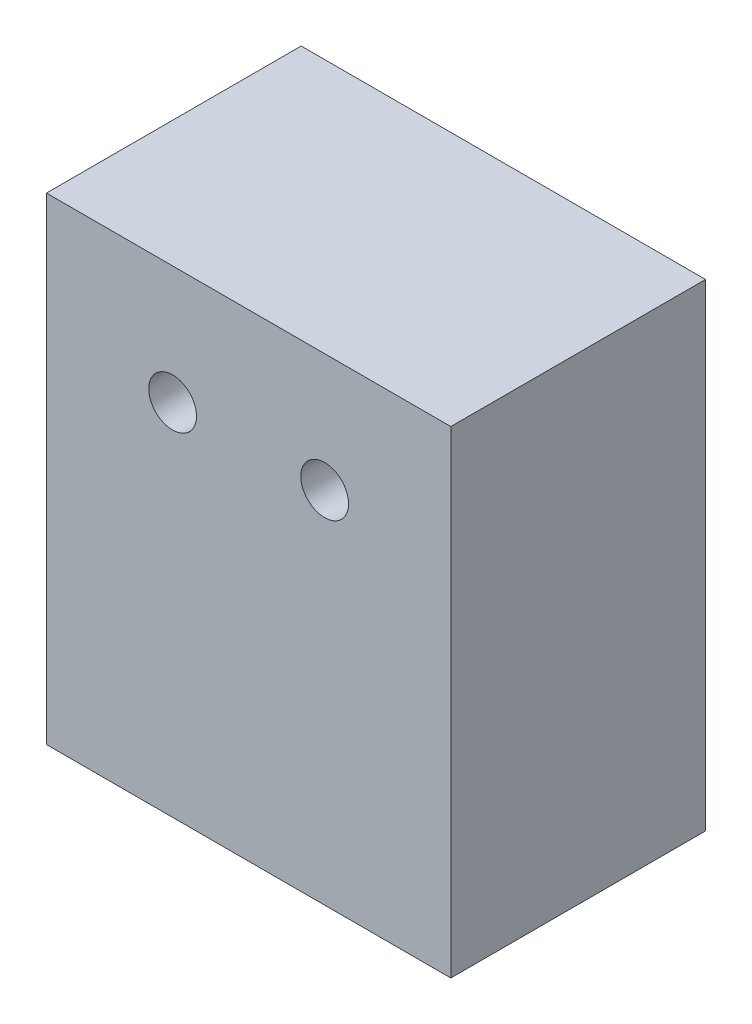
ISO-10303-21;
HEADER;
FILE_DESCRIPTION(('STEP AP214'),'2;1');
FILE_NAME('part.step','',(''),(''),'','','');
FILE_SCHEMA(('AUTOMOTIVE_DESIGN { 1 0 10303 214 1 1 1 1 }'));
ENDSEC;
DATA;
#1=APPLICATION_CONTEXT('core data for automotive mechanical design processes');
#2=APPLICATION_PROTOCOL_DEFINITION('international standard','automotive_design',2000,#1);
#3=PRODUCT_CONTEXT('',#1,'mechanical');
#4=PRODUCT('Part','Part','',(#3));
#5=PRODUCT_RELATED_PRODUCT_CATEGORY('part','',(#4));
#6=PRODUCT_DEFINITION_FORMATION('','',#4);
#7=PRODUCT_DEFINITION_CONTEXT('part definition',#1,'design');
#8=PRODUCT_DEFINITION('design','',#6,#7);
#9=PRODUCT_DEFINITION_SHAPE('','',#8);
#10=(LENGTH_UNIT() NAMED_UNIT(*) SI_UNIT(.MILLI.,.METRE.));
#11=(NAMED_UNIT(*) PLANE_ANGLE_UNIT() SI_UNIT($,.RADIAN.));
#12=(NAMED_UNIT(*) SI_UNIT($,.STERADIAN.) SOLID_ANGLE_UNIT());
#13=UNCERTAINTY_MEASURE_WITH_UNIT(LENGTH_MEASURE(1.E-05),#10,'distance_accuracy_value','');
#14=(GEOMETRIC_REPRESENTATION_CONTEXT(3) GLOBAL_UNCERTAINTY_ASSIGNED_CONTEXT((#13)) GLOBAL_UNIT_ASSIGNED_CONTEXT((#10,
#11,#12)) REPRESENTATION_CONTEXT('',''));
#15=CARTESIAN_POINT('',(0.,0.,0.));
#16=DIRECTION('',(0.,0.,1.));
#17=DIRECTION('',(1.,0.,0.));
#18=AXIS2_PLACEMENT_3D('',#15,#16,#17);
#19=CARTESIAN_POINT('',(6.35,7.5,8.));
#20=DIRECTION('',(-1.,0.,0.));
#21=DIRECTION('',(0.,-1.,0.));
#22=AXIS2_PLACEMENT_3D('',#19,#20,#21);
#23=PLANE('',#22);
#24=DIRECTION('',(0.,1.,0.));
#25=VECTOR('',#24,1.);
#26=CARTESIAN_POINT('',(6.35,7.5,0.));
#27=LINE('',#26,#25);
#28=CARTESIAN_POINT('',(6.35,-7.5,0.));
#29=VERTEX_POINT('',#28);
#30=CARTESIAN_POINT('',(6.35,7.5,0.));
#31=VERTEX_POINT('',#30);
#32=EDGE_CURVE('E95',#29,#31,#27,.T.);
#33=ORIENTED_EDGE('',*,*,#32,.T.);
#34=DIRECTION('',(0.,0.,-1.));
#35=VECTOR('',#34,1.);
#36=CARTESIAN_POINT('',(6.35,7.5,8.));
#37=LINE('',#36,#35);
#38=CARTESIAN_POINT('',(6.35,7.5,8.));
#39=VERTEX_POINT('',#38);
#40=EDGE_CURVE('E11',#39,#31,#37,.T.);
#41=ORIENTED_EDGE('',*,*,#40,.F.);
#42=DIRECTION('',(0.,1.,0.));
#43=VECTOR('',#42,1.);
#44=CARTESIAN_POINT('',(6.35,7.5,8.));
#45=LINE('',#44,#43);
#46=CARTESIAN_POINT('',(6.35,-7.5,8.));
#47=VERTEX_POINT('',#46);
#48=EDGE_CURVE('E83',#47,#39,#45,.T.);
#49=ORIENTED_EDGE('',*,*,#48,.F.);
#50=DIRECTION('',(0.,0.,-1.));
#51=VECTOR('',#50,1.);
#52=CARTESIAN_POINT('',(6.35,-7.5,8.));
#53=LINE('',#52,#51);
#54=EDGE_CURVE('E91',#47,#29,#53,.T.);
#55=ORIENTED_EDGE('',*,*,#54,.T.);
#56=EDGE_LOOP('',(#33,#41,#49,#55));
#57=FACE_BOUND('',#56,.T.);
#58=ADVANCED_FACE('F32',(#57),#23,.F.);
#59=CARTESIAN_POINT('',(-6.35,7.5,8.));
#60=DIRECTION('',(0.,-1.,0.));
#61=DIRECTION('',(0.,0.,-1.));
#62=AXIS2_PLACEMENT_3D('',#59,#60,#61);
#63=PLANE('',#62);
#64=DIRECTION('',(-1.,0.,0.));
#65=VECTOR('',#64,1.);
#66=CARTESIAN_POINT('',(-6.35,7.5,0.));
#67=LINE('',#66,#65);
#68=CARTESIAN_POINT('',(-6.35,7.5,0.));
#69=VERTEX_POINT('',#68);
#70=EDGE_CURVE('E87',#31,#69,#67,.T.);
#71=ORIENTED_EDGE('',*,*,#70,.T.);
#72=DIRECTION('',(0.,0.,-1.));
#73=VECTOR('',#72,1.);
#74=CARTESIAN_POINT('',(-6.35,7.5,8.));
#75=LINE('',#74,#73);
#76=CARTESIAN_POINT('',(-6.35,7.5,8.));
#77=VERTEX_POINT('',#76);
#78=EDGE_CURVE('E40',#77,#69,#75,.T.);
#79=ORIENTED_EDGE('',*,*,#78,.F.);
#80=DIRECTION('',(-1.,0.,0.));
#81=VECTOR('',#80,1.);
#82=CARTESIAN_POINT('',(-6.35,7.5,8.));
#83=LINE('',#82,#81);
#84=EDGE_CURVE('E78',#39,#77,#83,.T.);
#85=ORIENTED_EDGE('',*,*,#84,.F.);
#86=ORIENTED_EDGE('',*,*,#40,.T.);
#87=EDGE_LOOP('',(#71,#79,#85,#86));
#88=FACE_BOUND('',#87,.T.);
#89=ADVANCED_FACE('F86',(#88),#63,.F.);
#90=CARTESIAN_POINT('',(-6.35,7.5,8.));
#91=DIRECTION('',(1.,0.,0.));
#92=DIRECTION('',(0.,1.,0.));
#93=AXIS2_PLACEMENT_3D('',#90,#91,#92);
#94=PLANE('',#93);
#95=DIRECTION('',(0.,-1.,0.));
#96=VECTOR('',#95,1.);
#97=CARTESIAN_POINT('',(-6.35,7.5,0.));
#98=LINE('',#97,#96);
#99=CARTESIAN_POINT('',(-6.35,-7.5,0.));
#100=VERTEX_POINT('',#99);
#101=EDGE_CURVE('E65',#69,#100,#98,.T.);
#102=ORIENTED_EDGE('',*,*,#101,.T.);
#103=DIRECTION('',(0.,0.,-1.));
#104=VECTOR('',#103,1.);
#105=CARTESIAN_POINT('',(-6.35,-7.5,8.));
#106=LINE('',#105,#104);
#107=CARTESIAN_POINT('',(-6.35,-7.5,8.));
#108=VERTEX_POINT('',#107);
#109=EDGE_CURVE('E88',#108,#100,#106,.T.);
#110=ORIENTED_EDGE('',*,*,#109,.F.);
#111=DIRECTION('',(0.,-1.,0.));
#112=VECTOR('',#111,1.);
#113=CARTESIAN_POINT('',(-6.35,7.5,8.));
#114=LINE('',#113,#112);
#115=EDGE_CURVE('E81',#77,#108,#114,.T.);
#116=ORIENTED_EDGE('',*,*,#115,.F.);
#117=ORIENTED_EDGE('',*,*,#78,.T.);
#118=EDGE_LOOP('',(#102,#110,#116,#117));
#119=FACE_BOUND('',#118,.T.);
#120=ADVANCED_FACE('F89',(#119),#94,.F.);
#121=CARTESIAN_POINT('',(-6.35,-7.5,8.));
#122=DIRECTION('',(0.,1.,0.));
#123=DIRECTION('',(0.,0.,1.));
#124=AXIS2_PLACEMENT_3D('',#121,#122,#123);
#125=PLANE('',#124);
#126=CARTESIAN_POINT('',(2.5,-7.5,4.));
#127=DIRECTION('',(0.,-1.,0.));
#128=DIRECTION('',(0.,0.,-1.));
#129=AXIS2_PLACEMENT_3D('',#126,#127,#128);
#130=CIRCLE('',#129,1.25);
#131=CARTESIAN_POINT('',(2.5,-7.5,2.75));
#132=VERTEX_POINT('',#131);
#133=EDGE_CURVE('E127',#132,#132,#130,.T.);
#134=ORIENTED_EDGE('',*,*,#133,.F.);
#135=EDGE_LOOP('',(#134));
#136=FACE_BOUND('',#135,.T.);
#137=CARTESIAN_POINT('',(-2.5,-7.5,4.));
#138=DIRECTION('',(0.,-1.,0.));
#139=DIRECTION('',(0.,0.,-1.));
#140=AXIS2_PLACEMENT_3D('',#137,#138,#139);
#141=CIRCLE('',#140,1.25);
#142=CARTESIAN_POINT('',(-2.5,-7.5,2.75));
#143=VERTEX_POINT('',#142);
#144=EDGE_CURVE('E121',#143,#143,#141,.T.);
#145=ORIENTED_EDGE('',*,*,#144,.F.);
#146=EDGE_LOOP('',(#145));
#147=FACE_BOUND('',#146,.T.);
#148=DIRECTION('',(1.,0.,0.));
#149=VECTOR('',#148,1.);
#150=CARTESIAN_POINT('',(-6.35,-7.5,0.));
#151=LINE('',#150,#149);
#152=EDGE_CURVE('E71',#100,#29,#151,.T.);
#153=ORIENTED_EDGE('',*,*,#152,.T.);
#154=ORIENTED_EDGE('',*,*,#54,.F.);
#155=DIRECTION('',(1.,0.,0.));
#156=VECTOR('',#155,1.);
#157=CARTESIAN_POINT('',(-6.35,-7.5,8.));
#158=LINE('',#157,#156);
#159=EDGE_CURVE('E48',#108,#47,#158,.T.);
#160=ORIENTED_EDGE('',*,*,#159,.F.);
#161=ORIENTED_EDGE('',*,*,#109,.T.);
#162=EDGE_LOOP('',(#153,#154,#160,#161));
#163=FACE_BOUND('',#162,.T.);
#164=ADVANCED_FACE('F103',(#136,#147,#163),#125,.F.);
#165=CARTESIAN_POINT('',(0.,0.,8.));
#166=DIRECTION('',(0.,0.,1.));
#167=DIRECTION('',(1.,0.,0.));
#168=AXIS2_PLACEMENT_3D('',#165,#166,#167);
#169=PLANE('',#168);
#170=CARTESIAN_POINT('',(2.3876,3.79,8.));
#171=DIRECTION('',(0.,0.,1.));
#172=DIRECTION('',(1.,0.,0.));
#173=AXIS2_PLACEMENT_3D('',#170,#171,#172);
#174=CIRCLE('',#173,0.75);
#175=CARTESIAN_POINT('',(3.1376,3.79,8.));
#176=VERTEX_POINT('',#175);
#177=EDGE_CURVE('E115',#176,#176,#174,.T.);
#178=ORIENTED_EDGE('',*,*,#177,.F.);
#179=EDGE_LOOP('',(#178));
#180=FACE_BOUND('',#179,.T.);
#181=CARTESIAN_POINT('',(-2.3876,3.786,8.));
#182=DIRECTION('',(0.,0.,1.));
#183=DIRECTION('',(1.,0.,0.));
#184=AXIS2_PLACEMENT_3D('',#181,#182,#183);
#185=CIRCLE('',#184,0.75);
#186=CARTESIAN_POINT('',(-1.6376,3.786,8.));
#187=VERTEX_POINT('',#186);
#188=EDGE_CURVE('E109',#187,#187,#185,.T.);
#189=ORIENTED_EDGE('',*,*,#188,.F.);
#190=EDGE_LOOP('',(#189));
#191=FACE_BOUND('',#190,.T.);
#192=ORIENTED_EDGE('',*,*,#48,.T.);
#193=ORIENTED_EDGE('',*,*,#84,.T.);
#194=ORIENTED_EDGE('',*,*,#115,.T.);
#195=ORIENTED_EDGE('',*,*,#159,.T.);
#196=EDGE_LOOP('',(#192,#193,#194,#195));
#197=FACE_BOUND('',#196,.T.);
#198=ADVANCED_FACE('F79',(#180,#191,#197),#169,.T.);
#199=CARTESIAN_POINT('',(0.,0.,0.));
#200=DIRECTION('',(0.,0.,1.));
#201=DIRECTION('',(1.,0.,0.));
#202=AXIS2_PLACEMENT_3D('',#199,#200,#201);
#203=PLANE('',#202);
#204=CARTESIAN_POINT('',(2.3876,3.79,0.));
#205=DIRECTION('',(0.,0.,1.));
#206=DIRECTION('',(1.,0.,0.));
#207=AXIS2_PLACEMENT_3D('',#204,#205,#206);
#208=CIRCLE('',#207,0.75);
#209=CARTESIAN_POINT('',(3.1376,3.79,0.));
#210=VERTEX_POINT('',#209);
#211=EDGE_CURVE('E112',#210,#210,#208,.T.);
#212=ORIENTED_EDGE('',*,*,#211,.T.);
#213=EDGE_LOOP('',(#212));
#214=FACE_BOUND('',#213,.T.);
#215=CARTESIAN_POINT('',(-2.3876,3.786,0.));
#216=DIRECTION('',(0.,0.,1.));
#217=DIRECTION('',(1.,0.,0.));
#218=AXIS2_PLACEMENT_3D('',#215,#216,#217);
#219=CIRCLE('',#218,0.75);
#220=CARTESIAN_POINT('',(-1.6376,3.786,0.));
#221=VERTEX_POINT('',#220);
#222=EDGE_CURVE('E98',#221,#221,#219,.T.);
#223=ORIENTED_EDGE('',*,*,#222,.T.);
#224=EDGE_LOOP('',(#223));
#225=FACE_BOUND('',#224,.T.);
#226=ORIENTED_EDGE('',*,*,#32,.F.);
#227=ORIENTED_EDGE('',*,*,#152,.F.);
#228=ORIENTED_EDGE('',*,*,#101,.F.);
#229=ORIENTED_EDGE('',*,*,#70,.F.);
#230=EDGE_LOOP('',(#226,#227,#228,#229));
#231=FACE_BOUND('',#230,.T.);
#232=ADVANCED_FACE('F106',(#214,#225,#231),#203,.F.);
#233=CARTESIAN_POINT('',(-2.3876,3.786,0.));
#234=DIRECTION('',(0.,0.,1.));
#235=DIRECTION('',(1.,0.,0.));
#236=AXIS2_PLACEMENT_3D('',#233,#234,#235);
#237=CYLINDRICAL_SURFACE('',#236,0.75);
#238=ORIENTED_EDGE('',*,*,#222,.F.);
#239=EDGE_LOOP('',(#238));
#240=FACE_BOUND('',#239,.T.);
#241=ORIENTED_EDGE('',*,*,#188,.T.);
#242=EDGE_LOOP('',(#241));
#243=FACE_BOUND('',#242,.T.);
#244=ADVANCED_FACE('F158',(#240,#243),#237,.F.);
#245=CARTESIAN_POINT('',(2.3876,3.79,0.));
#246=DIRECTION('',(0.,0.,1.));
#247=DIRECTION('',(1.,0.,0.));
#248=AXIS2_PLACEMENT_3D('',#245,#246,#247);
#249=CYLINDRICAL_SURFACE('',#248,0.75);
#250=ORIENTED_EDGE('',*,*,#211,.F.);
#251=EDGE_LOOP('',(#250));
#252=FACE_BOUND('',#251,.T.);
#253=ORIENTED_EDGE('',*,*,#177,.T.);
#254=EDGE_LOOP('',(#253));
#255=FACE_BOUND('',#254,.T.);
#256=ADVANCED_FACE('F149',(#252,#255),#249,.F.);
#257=CARTESIAN_POINT('',(-2.5,-2.5,4.));
#258=DIRECTION('',(0.,-1.,0.));
#259=DIRECTION('',(0.,0.,-1.));
#260=AXIS2_PLACEMENT_3D('',#257,#258,#259);
#261=CYLINDRICAL_SURFACE('',#260,1.25);
#262=CARTESIAN_POINT('',(-2.5,-2.5,4.));
#263=DIRECTION('',(0.,-1.,0.));
#264=DIRECTION('',(0.,0.,-1.));
#265=AXIS2_PLACEMENT_3D('',#262,#263,#264);
#266=CIRCLE('',#265,1.25);
#267=CARTESIAN_POINT('',(-2.5,-2.5,2.75));
#268=VERTEX_POINT('',#267);
#269=EDGE_CURVE('E118',#268,#268,#266,.T.);
#270=ORIENTED_EDGE('',*,*,#269,.F.);
#271=EDGE_LOOP('',(#270));
#272=FACE_BOUND('',#271,.T.);
#273=ORIENTED_EDGE('',*,*,#144,.T.);
#274=EDGE_LOOP('',(#273));
#275=FACE_BOUND('',#274,.T.);
#276=ADVANCED_FACE('F147',(#272,#275),#261,.F.);
#277=CARTESIAN_POINT('',(-2.5,-2.5,4.));
#278=DIRECTION('',(0.,-1.,0.));
#279=DIRECTION('',(0.,0.,-1.));
#280=AXIS2_PLACEMENT_3D('',#277,#278,#279);
#281=PLANE('',#280);
#282=ORIENTED_EDGE('',*,*,#269,.T.);
#283=EDGE_LOOP('',(#282));
#284=FACE_BOUND('',#283,.T.);
#285=ADVANCED_FACE('F138',(#284),#281,.T.);
#286=CARTESIAN_POINT('',(2.5,-2.5,4.));
#287=DIRECTION('',(0.,-1.,0.));
#288=DIRECTION('',(0.,0.,-1.));
#289=AXIS2_PLACEMENT_3D('',#286,#287,#288);
#290=CYLINDRICAL_SURFACE('',#289,1.25);
#291=CARTESIAN_POINT('',(2.5,-2.5,4.));
#292=DIRECTION('',(0.,-1.,0.));
#293=DIRECTION('',(0.,0.,-1.));
#294=AXIS2_PLACEMENT_3D('',#291,#292,#293);
#295=CIRCLE('',#294,1.25);
#296=CARTESIAN_POINT('',(2.5,-2.5,2.75));
#297=VERTEX_POINT('',#296);
#298=EDGE_CURVE('E124',#297,#297,#295,.T.);
#299=ORIENTED_EDGE('',*,*,#298,.F.);
#300=EDGE_LOOP('',(#299));
#301=FACE_BOUND('',#300,.T.);
#302=ORIENTED_EDGE('',*,*,#133,.T.);
#303=EDGE_LOOP('',(#302));
#304=FACE_BOUND('',#303,.T.);
#305=ADVANCED_FACE('F135',(#301,#304),#290,.F.);
#306=CARTESIAN_POINT('',(2.5,-2.5,4.));
#307=DIRECTION('',(0.,-1.,0.));
#308=DIRECTION('',(0.,0.,-1.));
#309=AXIS2_PLACEMENT_3D('',#306,#307,#308);
#310=PLANE('',#309);
#311=ORIENTED_EDGE('',*,*,#298,.T.);
#312=EDGE_LOOP('',(#311));
#313=FACE_BOUND('',#312,.T.);
#314=ADVANCED_FACE('F133',(#313),#310,.T.);
#315=CLOSED_SHELL('',(#58,#89,#120,#164,#198,#232,#244,#256,#276,#285,#305,#314));
#316=MANIFOLD_SOLID_BREP('B2',#315);
#317=ADVANCED_BREP_SHAPE_REPRESENTATION('',(#18,#316),#14);
#318=SHAPE_DEFINITION_REPRESENTATION(#9,#317);
ENDSEC;
END-ISO-10303-21;
